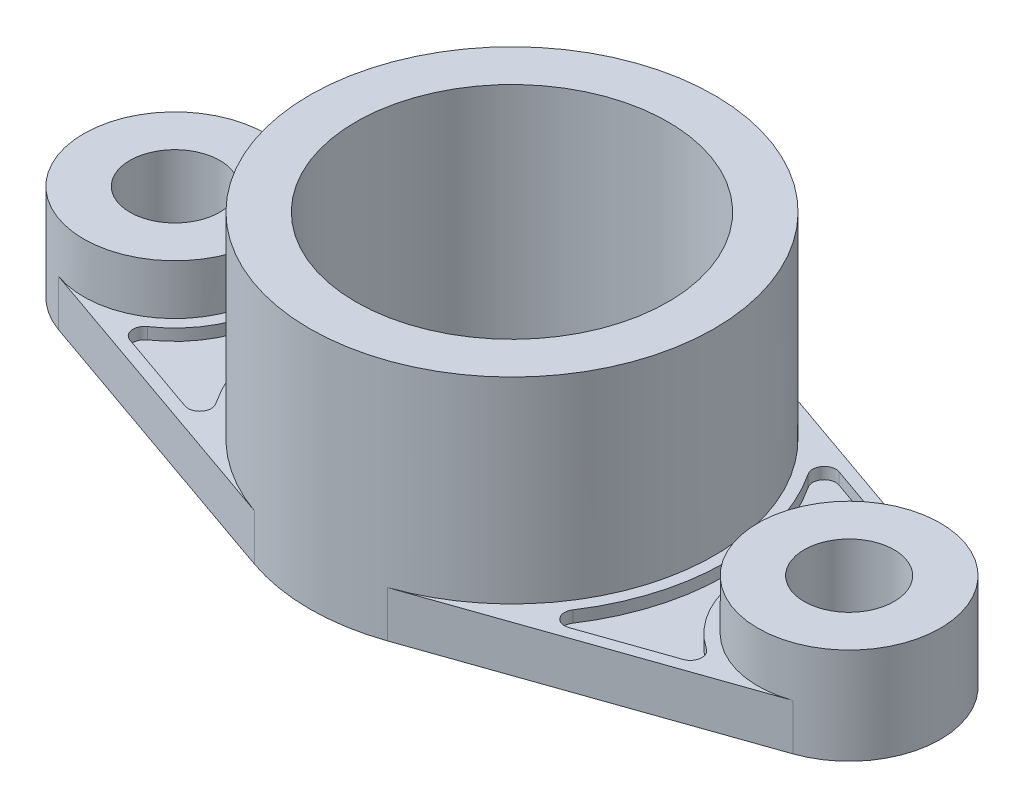
ISO-10303-21;
HEADER;
FILE_DESCRIPTION(('STEP AP214'),'2;1');
FILE_NAME('part.step','',(''),(''),'','','');
FILE_SCHEMA(('AUTOMOTIVE_DESIGN { 1 0 10303 214 1 1 1 1 }'));
ENDSEC;
DATA;
#1=APPLICATION_CONTEXT('core data for automotive mechanical design processes');
#2=APPLICATION_PROTOCOL_DEFINITION('international standard','automotive_design',2000,#1);
#3=PRODUCT_CONTEXT('',#1,'mechanical');
#4=PRODUCT('Part','Part','',(#3));
#5=PRODUCT_RELATED_PRODUCT_CATEGORY('part','',(#4));
#6=PRODUCT_DEFINITION_FORMATION('','',#4);
#7=PRODUCT_DEFINITION_CONTEXT('part definition',#1,'design');
#8=PRODUCT_DEFINITION('design','',#6,#7);
#9=PRODUCT_DEFINITION_SHAPE('','',#8);
#10=(LENGTH_UNIT() NAMED_UNIT(*) SI_UNIT(.MILLI.,.METRE.));
#11=(NAMED_UNIT(*) PLANE_ANGLE_UNIT() SI_UNIT($,.RADIAN.));
#12=(NAMED_UNIT(*) SI_UNIT($,.STERADIAN.) SOLID_ANGLE_UNIT());
#13=UNCERTAINTY_MEASURE_WITH_UNIT(LENGTH_MEASURE(1.E-05),#10,'distance_accuracy_value','');
#14=(GEOMETRIC_REPRESENTATION_CONTEXT(3) GLOBAL_UNCERTAINTY_ASSIGNED_CONTEXT((#13)) GLOBAL_UNIT_ASSIGNED_CONTEXT((#10,
#11,#12)) REPRESENTATION_CONTEXT('',''));
#15=CARTESIAN_POINT('',(0.,0.,0.));
#16=DIRECTION('',(0.,0.,1.));
#17=DIRECTION('',(1.,0.,0.));
#18=AXIS2_PLACEMENT_3D('',#15,#16,#17);
#19=CARTESIAN_POINT('',(0.,63.,0.));
#20=DIRECTION('',(0.,-1.,0.));
#21=DIRECTION('',(0.,0.,-1.));
#22=AXIS2_PLACEMENT_3D('',#19,#20,#21);
#23=CYLINDRICAL_SURFACE('',#22,52.5);
#24=CARTESIAN_POINT('',(0.,63.,0.));
#25=DIRECTION('',(0.,1.,0.));
#26=DIRECTION('',(0.,0.,1.));
#27=AXIS2_PLACEMENT_3D('',#24,#25,#26);
#28=CIRCLE('',#27,52.5);
#29=CARTESIAN_POINT('',(0.,63.,52.5));
#30=VERTEX_POINT('',#29);
#31=EDGE_CURVE('E11',#30,#30,#28,.T.);
#32=ORIENTED_EDGE('',*,*,#31,.F.);
#33=EDGE_LOOP('',(#32));
#34=FACE_BOUND('',#33,.T.);
#35=DIRECTION('',(0.,-1.,0.));
#36=VECTOR('',#35,1.);
#37=CARTESIAN_POINT('',(-17.301,12.,-49.5673824102101));
#38=LINE('',#37,#36);
#39=CARTESIAN_POINT('',(-17.301,12.,-49.5673824102101));
#40=VERTEX_POINT('',#39);
#41=CARTESIAN_POINT('',(-17.301,0.,-49.5673824102101));
#42=VERTEX_POINT('',#41);
#43=EDGE_CURVE('E366',#40,#42,#38,.T.);
#44=ORIENTED_EDGE('',*,*,#43,.F.);
#45=CARTESIAN_POINT('',(0.,12.,0.));
#46=DIRECTION('',(0.,1.,0.));
#47=DIRECTION('',(0.,0.,1.));
#48=AXIS2_PLACEMENT_3D('',#45,#46,#47);
#49=CIRCLE('',#48,52.5);
#50=CARTESIAN_POINT('',(-17.301,12.,49.56738241021));
#51=VERTEX_POINT('',#50);
#52=EDGE_CURVE('E344',#40,#51,#49,.T.);
#53=ORIENTED_EDGE('',*,*,#52,.T.);
#54=DIRECTION('',(0.,-1.,0.));
#55=VECTOR('',#54,1.);
#56=CARTESIAN_POINT('',(-17.301,12.,49.56738241021));
#57=LINE('',#56,#55);
#58=CARTESIAN_POINT('',(-17.301,0.,49.56738241021));
#59=VERTEX_POINT('',#58);
#60=EDGE_CURVE('E360',#51,#59,#57,.T.);
#61=ORIENTED_EDGE('',*,*,#60,.T.);
#62=CARTESIAN_POINT('',(0.,0.,0.));
#63=DIRECTION('',(0.,1.,0.));
#64=DIRECTION('',(0.,0.,1.));
#65=AXIS2_PLACEMENT_3D('',#62,#63,#64);
#66=CIRCLE('',#65,52.5);
#67=CARTESIAN_POINT('',(17.301,0.,49.56738241021));
#68=VERTEX_POINT('',#67);
#69=EDGE_CURVE('E413',#59,#68,#66,.T.);
#70=ORIENTED_EDGE('',*,*,#69,.T.);
#71=DIRECTION('',(0.,-1.,0.));
#72=VECTOR('',#71,1.);
#73=CARTESIAN_POINT('',(17.301,12.,49.56738241021));
#74=LINE('',#73,#72);
#75=CARTESIAN_POINT('',(17.301,12.,49.56738241021));
#76=VERTEX_POINT('',#75);
#77=EDGE_CURVE('E402',#76,#68,#74,.T.);
#78=ORIENTED_EDGE('',*,*,#77,.F.);
#79=CARTESIAN_POINT('',(0.,12.,0.));
#80=DIRECTION('',(0.,1.,0.));
#81=DIRECTION('',(0.,0.,1.));
#82=AXIS2_PLACEMENT_3D('',#79,#80,#81);
#83=CIRCLE('',#82,52.5);
#84=CARTESIAN_POINT('',(17.301,12.,-49.5673824102101));
#85=VERTEX_POINT('',#84);
#86=EDGE_CURVE('E388',#76,#85,#83,.T.);
#87=ORIENTED_EDGE('',*,*,#86,.T.);
#88=DIRECTION('',(0.,-1.,0.));
#89=VECTOR('',#88,1.);
#90=CARTESIAN_POINT('',(17.301,12.,-49.5673824102101));
#91=LINE('',#90,#89);
#92=CARTESIAN_POINT('',(17.301,0.,-49.5673824102101));
#93=VERTEX_POINT('',#92);
#94=EDGE_CURVE('E404',#85,#93,#91,.T.);
#95=ORIENTED_EDGE('',*,*,#94,.T.);
#96=EDGE_CURVE('E44',#93,#42,#66,.T.);
#97=ORIENTED_EDGE('',*,*,#96,.T.);
#98=EDGE_LOOP('',(#44,#53,#61,#70,#78,#87,#95,#97));
#99=FACE_BOUND('',#98,.T.);
#100=ADVANCED_FACE('F41',(#34,#99),#23,.T.);
#101=CARTESIAN_POINT('',(0.,63.,0.));
#102=DIRECTION('',(0.,-1.,0.));
#103=DIRECTION('',(0.,0.,-1.));
#104=AXIS2_PLACEMENT_3D('',#101,#102,#103);
#105=CYLINDRICAL_SURFACE('',#104,40.5);
#106=CARTESIAN_POINT('',(0.,63.,0.));
#107=DIRECTION('',(0.,1.,0.));
#108=DIRECTION('',(0.,0.,1.));
#109=AXIS2_PLACEMENT_3D('',#106,#107,#108);
#110=CIRCLE('',#109,40.5);
#111=CARTESIAN_POINT('',(0.,63.,40.5));
#112=VERTEX_POINT('',#111);
#113=EDGE_CURVE('E49',#112,#112,#110,.T.);
#114=ORIENTED_EDGE('',*,*,#113,.T.);
#115=EDGE_LOOP('',(#114));
#116=FACE_BOUND('',#115,.T.);
#117=CARTESIAN_POINT('',(0.,0.,0.));
#118=DIRECTION('',(0.,1.,0.));
#119=DIRECTION('',(0.,0.,1.));
#120=AXIS2_PLACEMENT_3D('',#117,#118,#119);
#121=CIRCLE('',#120,40.5);
#122=CARTESIAN_POINT('',(0.,0.,40.5));
#123=VERTEX_POINT('',#122);
#124=EDGE_CURVE('E409',#123,#123,#121,.T.);
#125=ORIENTED_EDGE('',*,*,#124,.F.);
#126=EDGE_LOOP('',(#125));
#127=FACE_BOUND('',#126,.T.);
#128=ADVANCED_FACE('F43',(#116,#127),#105,.F.);
#129=CARTESIAN_POINT('',(0.,63.,0.));
#130=DIRECTION('',(0.,1.,0.));
#131=DIRECTION('',(0.,0.,1.));
#132=AXIS2_PLACEMENT_3D('',#129,#130,#131);
#133=PLANE('',#132);
#134=ORIENTED_EDGE('',*,*,#113,.F.);
#135=EDGE_LOOP('',(#134));
#136=FACE_BOUND('',#135,.T.);
#137=ORIENTED_EDGE('',*,*,#31,.T.);
#138=EDGE_LOOP('',(#137));
#139=FACE_BOUND('',#138,.T.);
#140=ADVANCED_FACE('F471',(#136,#139),#133,.T.);
#141=CARTESIAN_POINT('',(0.,0.,0.));
#142=DIRECTION('',(0.,1.,0.));
#143=DIRECTION('',(0.,0.,1.));
#144=AXIS2_PLACEMENT_3D('',#141,#142,#143);
#145=PLANE('',#144);
#146=ORIENTED_EDGE('',*,*,#124,.T.);
#147=EDGE_LOOP('',(#146));
#148=FACE_BOUND('',#147,.T.);
#149=ORIENTED_EDGE('',*,*,#96,.F.);
#150=DIRECTION('',(-0.944140617337334,0.,-0.329542857142857));
#151=VECTOR('',#150,1.);
#152=CARTESIAN_POINT('',(17.301,0.,-49.5673824102101));
#153=LINE('',#152,#151);
#154=CARTESIAN_POINT('',(95.2986317142857,0.,-22.343087709288));
#155=VERTEX_POINT('',#154);
#156=EDGE_CURVE('E378',#155,#93,#153,.T.);
#157=ORIENTED_EDGE('',*,*,#156,.F.);
#158=CARTESIAN_POINT('',(87.5,0.,0.));
#159=DIRECTION('',(0.,1.,0.));
#160=DIRECTION('',(0.,0.,1.));
#161=AXIS2_PLACEMENT_3D('',#158,#159,#160);
#162=CIRCLE('',#161,23.665);
#163=CARTESIAN_POINT('',(95.2986317142857,0.,22.343087709288));
#164=VERTEX_POINT('',#163);
#165=EDGE_CURVE('E374',#155,#164,#162,.F.);
#166=ORIENTED_EDGE('',*,*,#165,.T.);
#167=DIRECTION('',(-0.944140617337334,0.,0.329542857142857));
#168=VECTOR('',#167,1.);
#169=CARTESIAN_POINT('',(17.301,0.,49.56738241021));
#170=LINE('',#169,#168);
#171=EDGE_CURVE('E390',#164,#68,#170,.T.);
#172=ORIENTED_EDGE('',*,*,#171,.T.);
#173=ORIENTED_EDGE('',*,*,#69,.F.);
#174=DIRECTION('',(0.944140617337334,0.,0.329542857142857));
#175=VECTOR('',#174,1.);
#176=CARTESIAN_POINT('',(-17.301,0.,49.56738241021));
#177=LINE('',#176,#175);
#178=CARTESIAN_POINT('',(-95.2986317142857,0.,22.343087709288));
#179=VERTEX_POINT('',#178);
#180=EDGE_CURVE('E346',#179,#59,#177,.T.);
#181=ORIENTED_EDGE('',*,*,#180,.F.);
#182=CARTESIAN_POINT('',(-87.5,0.,0.));
#183=DIRECTION('',(0.,1.,0.));
#184=DIRECTION('',(0.,0.,1.));
#185=AXIS2_PLACEMENT_3D('',#182,#183,#184);
#186=CIRCLE('',#185,23.665);
#187=CARTESIAN_POINT('',(-95.2986317142857,0.,-22.343087709288));
#188=VERTEX_POINT('',#187);
#189=EDGE_CURVE('E318',#188,#179,#186,.T.);
#190=ORIENTED_EDGE('',*,*,#189,.F.);
#191=DIRECTION('',(0.944140617337334,0.,-0.329542857142857));
#192=VECTOR('',#191,1.);
#193=CARTESIAN_POINT('',(-17.301,0.,-49.5673824102101));
#194=LINE('',#193,#192);
#195=EDGE_CURVE('E338',#188,#42,#194,.T.);
#196=ORIENTED_EDGE('',*,*,#195,.T.);
#197=EDGE_LOOP('',(#149,#157,#166,#172,#173,#181,#190,#196));
#198=FACE_BOUND('',#197,.T.);
#199=CARTESIAN_POINT('',(87.5,0.,0.));
#200=DIRECTION('',(0.,1.,0.));
#201=DIRECTION('',(0.,0.,1.));
#202=AXIS2_PLACEMENT_3D('',#199,#200,#201);
#203=CIRCLE('',#202,11.665);
#204=CARTESIAN_POINT('',(87.5,0.,11.665));
#205=VERTEX_POINT('',#204);
#206=EDGE_CURVE('E367',#205,#205,#203,.F.);
#207=ORIENTED_EDGE('',*,*,#206,.F.);
#208=EDGE_LOOP('',(#207));
#209=FACE_BOUND('',#208,.T.);
#210=CARTESIAN_POINT('',(-87.5,0.,0.));
#211=DIRECTION('',(0.,1.,0.));
#212=DIRECTION('',(0.,0.,1.));
#213=AXIS2_PLACEMENT_3D('',#210,#211,#212);
#214=CIRCLE('',#213,11.665);
#215=CARTESIAN_POINT('',(-87.5,0.,11.665));
#216=VERTEX_POINT('',#215);
#217=EDGE_CURVE('E336',#216,#216,#214,.T.);
#218=ORIENTED_EDGE('',*,*,#217,.T.);
#219=EDGE_LOOP('',(#218));
#220=FACE_BOUND('',#219,.T.);
#221=ADVANCED_FACE('F424',(#148,#198,#209,#220),#145,.F.);
#222=CARTESIAN_POINT('',(17.301,12.,-49.5673824102101));
#223=DIRECTION('',(-0.329542857142857,0.,0.944140617337334));
#224=DIRECTION('',(0.944140617337334,0.,0.329542857142857));
#225=AXIS2_PLACEMENT_3D('',#222,#223,#224);
#226=PLANE('',#225);
#227=ORIENTED_EDGE('',*,*,#156,.T.);
#228=ORIENTED_EDGE('',*,*,#94,.F.);
#229=DIRECTION('',(-0.944140617337334,0.,-0.329542857142857));
#230=VECTOR('',#229,1.);
#231=CARTESIAN_POINT('',(17.301,12.,-49.5673824102101));
#232=LINE('',#231,#230);
#233=CARTESIAN_POINT('',(95.2986317142857,12.,-22.343087709288));
#234=VERTEX_POINT('',#233);
#235=EDGE_CURVE('E387',#234,#85,#232,.T.);
#236=ORIENTED_EDGE('',*,*,#235,.F.);
#237=DIRECTION('',(0.,-1.,0.));
#238=VECTOR('',#237,1.);
#239=CARTESIAN_POINT('',(95.2986317142857,12.,-22.343087709288));
#240=LINE('',#239,#238);
#241=EDGE_CURVE('E410',#234,#155,#240,.T.);
#242=ORIENTED_EDGE('',*,*,#241,.T.);
#243=EDGE_LOOP('',(#227,#228,#236,#242));
#244=FACE_BOUND('',#243,.T.);
#245=ADVANCED_FACE('F447',(#244),#226,.F.);
#246=CARTESIAN_POINT('',(17.301,12.,49.56738241021));
#247=DIRECTION('',(0.329542857142857,0.,0.944140617337334));
#248=DIRECTION('',(0.944140617337334,0.,-0.329542857142857));
#249=AXIS2_PLACEMENT_3D('',#246,#247,#248);
#250=PLANE('',#249);
#251=ORIENTED_EDGE('',*,*,#171,.F.);
#252=DIRECTION('',(0.,-1.,0.));
#253=VECTOR('',#252,1.);
#254=CARTESIAN_POINT('',(95.2986317142857,12.,22.343087709288));
#255=LINE('',#254,#253);
#256=CARTESIAN_POINT('',(95.2986317142857,12.,22.343087709288));
#257=VERTEX_POINT('',#256);
#258=EDGE_CURVE('E397',#257,#164,#255,.T.);
#259=ORIENTED_EDGE('',*,*,#258,.F.);
#260=DIRECTION('',(-0.944140617337334,0.,0.329542857142857));
#261=VECTOR('',#260,1.);
#262=CARTESIAN_POINT('',(17.301,12.,49.56738241021));
#263=LINE('',#262,#261);
#264=EDGE_CURVE('E392',#257,#76,#263,.T.);
#265=ORIENTED_EDGE('',*,*,#264,.T.);
#266=ORIENTED_EDGE('',*,*,#77,.T.);
#267=EDGE_LOOP('',(#251,#259,#265,#266));
#268=FACE_BOUND('',#267,.T.);
#269=ADVANCED_FACE('F445',(#268),#250,.T.);
#270=CARTESIAN_POINT('',(0.,12.,0.));
#271=DIRECTION('',(0.,1.,0.));
#272=DIRECTION('',(0.,0.,1.));
#273=AXIS2_PLACEMENT_3D('',#270,#271,#272);
#274=PLANE('',#273);
#275=CARTESIAN_POINT('',(0.,12.,0.));
#276=DIRECTION('',(0.,-1.,0.));
#277=DIRECTION('',(0.,0.,1.));
#278=AXIS2_PLACEMENT_3D('',#275,#276,#277);
#279=CIRCLE('',#278,55.5);
#280=CARTESIAN_POINT('',(46.3329275961724,12.,-30.5533929436299));
#281=VERTEX_POINT('',#280);
#282=CARTESIAN_POINT('',(46.3329275961724,12.,30.5533929436299));
#283=VERTEX_POINT('',#282);
#284=EDGE_CURVE('E241',#281,#283,#279,.T.);
#285=ORIENTED_EDGE('',*,*,#284,.F.);
#286=CARTESIAN_POINT('',(48.8374101689385,12.,-32.2049276973396));
#287=DIRECTION('',(0.,-1.,0.));
#288=DIRECTION('',(0.,0.,1.));
#289=AXIS2_PLACEMENT_3D('',#286,#287,#288);
#290=CIRCLE('',#289,3.);
#291=CARTESIAN_POINT('',(49.826038740367,12.,-35.0373495493516));
#292=VERTEX_POINT('',#291);
#293=EDGE_CURVE('E59',#281,#292,#290,.T.);
#294=ORIENTED_EDGE('',*,*,#293,.T.);
#295=DIRECTION('',(0.944140617337334,0.,0.329542857142858));
#296=VECTOR('',#295,1.);
#297=CARTESIAN_POINT('',(49.826038740367,12.,-35.0373495493516));
#298=LINE('',#297,#296);
#299=CARTESIAN_POINT('',(71.8093276206941,12.,-27.3643020244495));
#300=VERTEX_POINT('',#299);
#301=EDGE_CURVE('E222',#292,#300,#298,.T.);
#302=ORIENTED_EDGE('',*,*,#301,.T.);
#303=CARTESIAN_POINT('',(70.8206990492656,12.,-24.5318801724375));
#304=DIRECTION('',(0.,1.,0.));
#305=DIRECTION('',(0.,0.,-1.));
#306=AXIS2_PLACEMENT_3D('',#303,#304,#305);
#307=CIRCLE('',#306,3.);
#308=CARTESIAN_POINT('',(72.507464694039,12.,-22.0509888689717));
#309=VERTEX_POINT('',#308);
#310=EDGE_CURVE('E254',#309,#300,#307,.T.);
#311=ORIENTED_EDGE('',*,*,#310,.F.);
#312=CARTESIAN_POINT('',(87.5,12.,0.));
#313=DIRECTION('',(0.,-1.,0.));
#314=DIRECTION('',(0.,0.,1.));
#315=AXIS2_PLACEMENT_3D('',#312,#313,#314);
#316=CIRCLE('',#315,26.665);
#317=CARTESIAN_POINT('',(72.507464694039,12.,22.0509888689717));
#318=VERTEX_POINT('',#317);
#319=EDGE_CURVE('E252',#318,#309,#316,.T.);
#320=ORIENTED_EDGE('',*,*,#319,.F.);
#321=CARTESIAN_POINT('',(70.8206990492656,12.,24.5318801724375));
#322=DIRECTION('',(0.,1.,0.));
#323=DIRECTION('',(0.,0.,-1.));
#324=AXIS2_PLACEMENT_3D('',#321,#322,#323);
#325=CIRCLE('',#324,3.);
#326=CARTESIAN_POINT('',(71.8093276206941,12.,27.3643020244495));
#327=VERTEX_POINT('',#326);
#328=EDGE_CURVE('E249',#327,#318,#325,.T.);
#329=ORIENTED_EDGE('',*,*,#328,.F.);
#330=DIRECTION('',(-0.944140617337334,0.,0.329542857142857));
#331=VECTOR('',#330,1.);
#332=CARTESIAN_POINT('',(71.8093276206941,12.,27.3643020244495));
#333=LINE('',#332,#331);
#334=CARTESIAN_POINT('',(49.826038740367,12.,35.0373495493516));
#335=VERTEX_POINT('',#334);
#336=EDGE_CURVE('E247',#327,#335,#333,.T.);
#337=ORIENTED_EDGE('',*,*,#336,.T.);
#338=CARTESIAN_POINT('',(48.8374101689384,12.,32.2049276973396));
#339=DIRECTION('',(0.,-1.,0.));
#340=DIRECTION('',(0.,0.,1.));
#341=AXIS2_PLACEMENT_3D('',#338,#339,#340);
#342=CIRCLE('',#341,3.);
#343=EDGE_CURVE('E242',#335,#283,#342,.T.);
#344=ORIENTED_EDGE('',*,*,#343,.T.);
#345=EDGE_LOOP('',(#285,#294,#302,#311,#320,#329,#337,#344));
#346=FACE_BOUND('',#345,.T.);
#347=CARTESIAN_POINT('',(87.5,12.,0.));
#348=DIRECTION('',(0.,1.,0.));
#349=DIRECTION('',(0.,0.,1.));
#350=AXIS2_PLACEMENT_3D('',#347,#348,#349);
#351=CIRCLE('',#350,23.665);
#352=EDGE_CURVE('E382',#257,#234,#351,.F.);
#353=ORIENTED_EDGE('',*,*,#352,.T.);
#354=ORIENTED_EDGE('',*,*,#235,.T.);
#355=ORIENTED_EDGE('',*,*,#86,.F.);
#356=ORIENTED_EDGE('',*,*,#264,.F.);
#357=EDGE_LOOP('',(#353,#354,#355,#356));
#358=FACE_BOUND('',#357,.T.);
#359=ADVANCED_FACE('F443',(#346,#358),#274,.T.);
#360=CARTESIAN_POINT('',(87.5,25.,0.));
#361=DIRECTION('',(0.,-1.,0.));
#362=DIRECTION('',(0.,0.,-1.));
#363=AXIS2_PLACEMENT_3D('',#360,#361,#362);
#364=CYLINDRICAL_SURFACE('',#363,23.665);
#365=CARTESIAN_POINT('',(87.5,25.,0.));
#366=DIRECTION('',(0.,1.,0.));
#367=DIRECTION('',(0.,0.,1.));
#368=AXIS2_PLACEMENT_3D('',#365,#366,#367);
#369=CIRCLE('',#368,23.665);
#370=CARTESIAN_POINT('',(87.5,25.,23.665));
#371=VERTEX_POINT('',#370);
#372=EDGE_CURVE('E372',#371,#371,#369,.F.);
#373=ORIENTED_EDGE('',*,*,#372,.T.);
#374=EDGE_LOOP('',(#373));
#375=FACE_BOUND('',#374,.T.);
#376=ORIENTED_EDGE('',*,*,#241,.F.);
#377=ORIENTED_EDGE('',*,*,#352,.F.);
#378=ORIENTED_EDGE('',*,*,#258,.T.);
#379=ORIENTED_EDGE('',*,*,#165,.F.);
#380=EDGE_LOOP('',(#376,#377,#378,#379));
#381=FACE_BOUND('',#380,.T.);
#382=ADVANCED_FACE('F449',(#375,#381),#364,.T.);
#383=CARTESIAN_POINT('',(87.5,25.,0.));
#384=DIRECTION('',(0.,-1.,0.));
#385=DIRECTION('',(0.,0.,-1.));
#386=AXIS2_PLACEMENT_3D('',#383,#384,#385);
#387=CYLINDRICAL_SURFACE('',#386,11.665);
#388=CARTESIAN_POINT('',(87.5,25.,0.));
#389=DIRECTION('',(0.,1.,0.));
#390=DIRECTION('',(0.,0.,1.));
#391=AXIS2_PLACEMENT_3D('',#388,#389,#390);
#392=CIRCLE('',#391,11.665);
#393=CARTESIAN_POINT('',(87.5,25.,11.665));
#394=VERTEX_POINT('',#393);
#395=EDGE_CURVE('E371',#394,#394,#392,.F.);
#396=ORIENTED_EDGE('',*,*,#395,.F.);
#397=EDGE_LOOP('',(#396));
#398=FACE_BOUND('',#397,.T.);
#399=ORIENTED_EDGE('',*,*,#206,.T.);
#400=EDGE_LOOP('',(#399));
#401=FACE_BOUND('',#400,.T.);
#402=ADVANCED_FACE('F455',(#398,#401),#387,.F.);
#403=CARTESIAN_POINT('',(0.,25.,0.));
#404=DIRECTION('',(0.,1.,0.));
#405=DIRECTION('',(0.,0.,1.));
#406=AXIS2_PLACEMENT_3D('',#403,#404,#405);
#407=PLANE('',#406);
#408=ORIENTED_EDGE('',*,*,#395,.T.);
#409=EDGE_LOOP('',(#408));
#410=FACE_BOUND('',#409,.T.);
#411=ORIENTED_EDGE('',*,*,#372,.F.);
#412=EDGE_LOOP('',(#411));
#413=FACE_BOUND('',#412,.T.);
#414=ADVANCED_FACE('F459',(#410,#413),#407,.T.);
#415=CARTESIAN_POINT('',(-17.301,12.,-49.5673824102101));
#416=DIRECTION('',(-0.329542857142857,0.,-0.944140617337334));
#417=DIRECTION('',(-0.944140617337334,0.,0.329542857142857));
#418=AXIS2_PLACEMENT_3D('',#415,#416,#417);
#419=PLANE('',#418);
#420=ORIENTED_EDGE('',*,*,#195,.F.);
#421=DIRECTION('',(0.,-1.,0.));
#422=VECTOR('',#421,1.);
#423=CARTESIAN_POINT('',(-95.2986317142857,12.,-22.343087709288));
#424=LINE('',#423,#422);
#425=CARTESIAN_POINT('',(-95.2986317142857,12.,-22.343087709288));
#426=VERTEX_POINT('',#425);
#427=EDGE_CURVE('E364',#426,#188,#424,.T.);
#428=ORIENTED_EDGE('',*,*,#427,.F.);
#429=DIRECTION('',(0.944140617337334,0.,-0.329542857142857));
#430=VECTOR('',#429,1.);
#431=CARTESIAN_POINT('',(-17.301,12.,-49.5673824102101));
#432=LINE('',#431,#430);
#433=EDGE_CURVE('E350',#426,#40,#432,.T.);
#434=ORIENTED_EDGE('',*,*,#433,.T.);
#435=ORIENTED_EDGE('',*,*,#43,.T.);
#436=EDGE_LOOP('',(#420,#428,#434,#435));
#437=FACE_BOUND('',#436,.T.);
#438=ADVANCED_FACE('F429',(#437),#419,.T.);
#439=CARTESIAN_POINT('',(-17.301,12.,49.56738241021));
#440=DIRECTION('',(0.329542857142857,0.,-0.944140617337334));
#441=DIRECTION('',(-0.944140617337334,0.,-0.329542857142857));
#442=AXIS2_PLACEMENT_3D('',#439,#440,#441);
#443=PLANE('',#442);
#444=ORIENTED_EDGE('',*,*,#180,.T.);
#445=ORIENTED_EDGE('',*,*,#60,.F.);
#446=DIRECTION('',(0.944140617337334,0.,0.329542857142857));
#447=VECTOR('',#446,1.);
#448=CARTESIAN_POINT('',(-17.301,12.,49.56738241021));
#449=LINE('',#448,#447);
#450=CARTESIAN_POINT('',(-95.2986317142857,12.,22.343087709288));
#451=VERTEX_POINT('',#450);
#452=EDGE_CURVE('E353',#451,#51,#449,.T.);
#453=ORIENTED_EDGE('',*,*,#452,.F.);
#454=DIRECTION('',(0.,-1.,0.));
#455=VECTOR('',#454,1.);
#456=CARTESIAN_POINT('',(-95.2986317142857,12.,22.343087709288));
#457=LINE('',#456,#455);
#458=EDGE_CURVE('E361',#451,#179,#457,.T.);
#459=ORIENTED_EDGE('',*,*,#458,.T.);
#460=EDGE_LOOP('',(#444,#445,#453,#459));
#461=FACE_BOUND('',#460,.T.);
#462=ADVANCED_FACE('F590',(#461),#443,.F.);
#463=CARTESIAN_POINT('',(0.,12.,0.));
#464=DIRECTION('',(0.,1.,0.));
#465=DIRECTION('',(0.,0.,1.));
#466=AXIS2_PLACEMENT_3D('',#463,#464,#465);
#467=PLANE('',#466);
#468=CARTESIAN_POINT('',(-48.8374101689385,12.,-32.2049276973396));
#469=DIRECTION('',(0.,1.,0.));
#470=DIRECTION('',(0.,0.,1.));
#471=AXIS2_PLACEMENT_3D('',#468,#469,#470);
#472=CIRCLE('',#471,3.);
#473=CARTESIAN_POINT('',(-46.3329275961724,12.,-30.5533929436299));
#474=VERTEX_POINT('',#473);
#475=CARTESIAN_POINT('',(-49.826038740367,12.,-35.0373495493516));
#476=VERTEX_POINT('',#475);
#477=EDGE_CURVE('E67',#474,#476,#472,.T.);
#478=ORIENTED_EDGE('',*,*,#477,.F.);
#479=CARTESIAN_POINT('',(0.,12.,0.));
#480=DIRECTION('',(0.,1.,0.));
#481=DIRECTION('',(0.,0.,1.));
#482=AXIS2_PLACEMENT_3D('',#479,#480,#481);
#483=CIRCLE('',#482,55.5);
#484=CARTESIAN_POINT('',(-46.3329275961724,12.,30.5533929436299));
#485=VERTEX_POINT('',#484);
#486=EDGE_CURVE('E280',#474,#485,#483,.T.);
#487=ORIENTED_EDGE('',*,*,#486,.T.);
#488=CARTESIAN_POINT('',(-48.8374101689384,12.,32.2049276973396));
#489=DIRECTION('',(0.,1.,0.));
#490=DIRECTION('',(0.,0.,1.));
#491=AXIS2_PLACEMENT_3D('',#488,#489,#490);
#492=CIRCLE('',#491,3.);
#493=CARTESIAN_POINT('',(-49.826038740367,12.,35.0373495493516));
#494=VERTEX_POINT('',#493);
#495=EDGE_CURVE('E313',#494,#485,#492,.T.);
#496=ORIENTED_EDGE('',*,*,#495,.F.);
#497=DIRECTION('',(0.944140617337334,0.,0.329542857142857));
#498=VECTOR('',#497,1.);
#499=CARTESIAN_POINT('',(-71.8093276206941,12.,27.3643020244495));
#500=LINE('',#499,#498);
#501=CARTESIAN_POINT('',(-71.8093276206941,12.,27.3643020244495));
#502=VERTEX_POINT('',#501);
#503=EDGE_CURVE('E306',#502,#494,#500,.T.);
#504=ORIENTED_EDGE('',*,*,#503,.F.);
#505=CARTESIAN_POINT('',(-70.8206990492656,12.,24.5318801724375));
#506=DIRECTION('',(0.,-1.,0.));
#507=DIRECTION('',(0.,0.,-1.));
#508=AXIS2_PLACEMENT_3D('',#505,#506,#507);
#509=CIRCLE('',#508,3.);
#510=CARTESIAN_POINT('',(-72.507464694039,12.,22.0509888689717));
#511=VERTEX_POINT('',#510);
#512=EDGE_CURVE('E301',#502,#511,#509,.T.);
#513=ORIENTED_EDGE('',*,*,#512,.T.);
#514=CARTESIAN_POINT('',(-87.5,12.,0.));
#515=DIRECTION('',(0.,1.,0.));
#516=DIRECTION('',(0.,0.,1.));
#517=AXIS2_PLACEMENT_3D('',#514,#515,#516);
#518=CIRCLE('',#517,26.665);
#519=CARTESIAN_POINT('',(-72.507464694039,12.,-22.0509888689717));
#520=VERTEX_POINT('',#519);
#521=EDGE_CURVE('E305',#511,#520,#518,.T.);
#522=ORIENTED_EDGE('',*,*,#521,.T.);
#523=CARTESIAN_POINT('',(-70.8206990492656,12.,-24.5318801724375));
#524=DIRECTION('',(0.,-1.,0.));
#525=DIRECTION('',(0.,0.,-1.));
#526=AXIS2_PLACEMENT_3D('',#523,#524,#525);
#527=CIRCLE('',#526,3.);
#528=CARTESIAN_POINT('',(-71.8093276206941,12.,-27.3643020244495));
#529=VERTEX_POINT('',#528);
#530=EDGE_CURVE('E298',#520,#529,#527,.T.);
#531=ORIENTED_EDGE('',*,*,#530,.T.);
#532=DIRECTION('',(-0.944140617337334,0.,0.329542857142858));
#533=VECTOR('',#532,1.);
#534=CARTESIAN_POINT('',(-49.826038740367,12.,-35.0373495493516));
#535=LINE('',#534,#533);
#536=EDGE_CURVE('E296',#476,#529,#535,.T.);
#537=ORIENTED_EDGE('',*,*,#536,.F.);
#538=EDGE_LOOP('',(#478,#487,#496,#504,#513,#522,#531,#537));
#539=FACE_BOUND('',#538,.T.);
#540=ORIENTED_EDGE('',*,*,#52,.F.);
#541=ORIENTED_EDGE('',*,*,#433,.F.);
#542=CARTESIAN_POINT('',(-87.5,12.,0.));
#543=DIRECTION('',(0.,1.,0.));
#544=DIRECTION('',(0.,0.,1.));
#545=AXIS2_PLACEMENT_3D('',#542,#543,#544);
#546=CIRCLE('',#545,23.665);
#547=EDGE_CURVE('E351',#451,#426,#546,.T.);
#548=ORIENTED_EDGE('',*,*,#547,.F.);
#549=ORIENTED_EDGE('',*,*,#452,.T.);
#550=EDGE_LOOP('',(#540,#541,#548,#549));
#551=FACE_BOUND('',#550,.T.);
#552=ADVANCED_FACE('F440',(#539,#551),#467,.T.);
#553=CARTESIAN_POINT('',(-87.5,25.,0.));
#554=DIRECTION('',(0.,-1.,0.));
#555=DIRECTION('',(0.,0.,-1.));
#556=AXIS2_PLACEMENT_3D('',#553,#554,#555);
#557=CYLINDRICAL_SURFACE('',#556,23.665);
#558=ORIENTED_EDGE('',*,*,#458,.F.);
#559=ORIENTED_EDGE('',*,*,#547,.T.);
#560=ORIENTED_EDGE('',*,*,#427,.T.);
#561=ORIENTED_EDGE('',*,*,#189,.T.);
#562=EDGE_LOOP('',(#558,#559,#560,#561));
#563=FACE_BOUND('',#562,.T.);
#564=CARTESIAN_POINT('',(-87.5,25.,0.));
#565=DIRECTION('',(0.,1.,0.));
#566=DIRECTION('',(0.,0.,1.));
#567=AXIS2_PLACEMENT_3D('',#564,#565,#566);
#568=CIRCLE('',#567,23.665);
#569=CARTESIAN_POINT('',(-87.5,25.,23.665));
#570=VERTEX_POINT('',#569);
#571=EDGE_CURVE('E335',#570,#570,#568,.T.);
#572=ORIENTED_EDGE('',*,*,#571,.F.);
#573=EDGE_LOOP('',(#572));
#574=FACE_BOUND('',#573,.T.);
#575=ADVANCED_FACE('F433',(#563,#574),#557,.T.);
#576=CARTESIAN_POINT('',(-87.5,25.,0.));
#577=DIRECTION('',(0.,-1.,0.));
#578=DIRECTION('',(0.,0.,-1.));
#579=AXIS2_PLACEMENT_3D('',#576,#577,#578);
#580=CYLINDRICAL_SURFACE('',#579,11.665);
#581=CARTESIAN_POINT('',(-87.5,25.,0.));
#582=DIRECTION('',(0.,1.,0.));
#583=DIRECTION('',(0.,0.,1.));
#584=AXIS2_PLACEMENT_3D('',#581,#582,#583);
#585=CIRCLE('',#584,11.665);
#586=CARTESIAN_POINT('',(-87.5,25.,11.665));
#587=VERTEX_POINT('',#586);
#588=EDGE_CURVE('E333',#587,#587,#585,.T.);
#589=ORIENTED_EDGE('',*,*,#588,.T.);
#590=EDGE_LOOP('',(#589));
#591=FACE_BOUND('',#590,.T.);
#592=ORIENTED_EDGE('',*,*,#217,.F.);
#593=EDGE_LOOP('',(#592));
#594=FACE_BOUND('',#593,.T.);
#595=ADVANCED_FACE('F525',(#591,#594),#580,.F.);
#596=CARTESIAN_POINT('',(0.,25.,0.));
#597=DIRECTION('',(0.,1.,0.));
#598=DIRECTION('',(0.,0.,1.));
#599=AXIS2_PLACEMENT_3D('',#596,#597,#598);
#600=PLANE('',#599);
#601=ORIENTED_EDGE('',*,*,#571,.T.);
#602=EDGE_LOOP('',(#601));
#603=FACE_BOUND('',#602,.T.);
#604=ORIENTED_EDGE('',*,*,#588,.F.);
#605=EDGE_LOOP('',(#604));
#606=FACE_BOUND('',#605,.T.);
#607=ADVANCED_FACE('F513',(#603,#606),#600,.T.);
#608=CARTESIAN_POINT('',(-48.8374101689385,9.,-32.2049276973396));
#609=DIRECTION('',(0.,1.,0.));
#610=DIRECTION('',(0.,0.,1.));
#611=AXIS2_PLACEMENT_3D('',#608,#609,#610);
#612=CYLINDRICAL_SURFACE('',#611,3.);
#613=ORIENTED_EDGE('',*,*,#477,.T.);
#614=DIRECTION('',(0.,1.,0.));
#615=VECTOR('',#614,1.);
#616=CARTESIAN_POINT('',(-49.826038740367,9.,-35.0373495493516));
#617=LINE('',#616,#615);
#618=CARTESIAN_POINT('',(-49.826038740367,9.,-35.0373495493516));
#619=VERTEX_POINT('',#618);
#620=EDGE_CURVE('E294',#619,#476,#617,.T.);
#621=ORIENTED_EDGE('',*,*,#620,.F.);
#622=CARTESIAN_POINT('',(-48.8374101689385,9.,-32.2049276973396));
#623=DIRECTION('',(0.,1.,0.));
#624=DIRECTION('',(0.,0.,1.));
#625=AXIS2_PLACEMENT_3D('',#622,#623,#624);
#626=CIRCLE('',#625,3.);
#627=CARTESIAN_POINT('',(-46.3329275961724,9.,-30.5533929436299));
#628=VERTEX_POINT('',#627);
#629=EDGE_CURVE('E272',#628,#619,#626,.T.);
#630=ORIENTED_EDGE('',*,*,#629,.F.);
#631=DIRECTION('',(0.,1.,0.));
#632=VECTOR('',#631,1.);
#633=CARTESIAN_POINT('',(-46.3329275961724,9.,-30.5533929436299));
#634=LINE('',#633,#632);
#635=EDGE_CURVE('E316',#628,#474,#634,.T.);
#636=ORIENTED_EDGE('',*,*,#635,.T.);
#637=EDGE_LOOP('',(#613,#621,#630,#636));
#638=FACE_BOUND('',#637,.T.);
#639=ADVANCED_FACE('F522',(#638),#612,.F.);
#640=CARTESIAN_POINT('',(0.,9.,0.));
#641=DIRECTION('',(0.,1.,0.));
#642=DIRECTION('',(0.,0.,1.));
#643=AXIS2_PLACEMENT_3D('',#640,#641,#642);
#644=CYLINDRICAL_SURFACE('',#643,55.5);
#645=ORIENTED_EDGE('',*,*,#486,.F.);
#646=ORIENTED_EDGE('',*,*,#635,.F.);
#647=CARTESIAN_POINT('',(0.,9.,0.));
#648=DIRECTION('',(0.,1.,0.));
#649=DIRECTION('',(0.,0.,1.));
#650=AXIS2_PLACEMENT_3D('',#647,#648,#649);
#651=CIRCLE('',#650,55.5);
#652=CARTESIAN_POINT('',(-46.3329275961724,9.,30.5533929436299));
#653=VERTEX_POINT('',#652);
#654=EDGE_CURVE('E295',#628,#653,#651,.T.);
#655=ORIENTED_EDGE('',*,*,#654,.T.);
#656=DIRECTION('',(0.,1.,0.));
#657=VECTOR('',#656,1.);
#658=CARTESIAN_POINT('',(-46.3329275961724,9.,30.5533929436299));
#659=LINE('',#658,#657);
#660=EDGE_CURVE('E317',#653,#485,#659,.T.);
#661=ORIENTED_EDGE('',*,*,#660,.T.);
#662=EDGE_LOOP('',(#645,#646,#655,#661));
#663=FACE_BOUND('',#662,.T.);
#664=ADVANCED_FACE('F613',(#663),#644,.T.);
#665=CARTESIAN_POINT('',(-48.8374101689384,9.,32.2049276973396));
#666=DIRECTION('',(0.,1.,0.));
#667=DIRECTION('',(0.,0.,1.));
#668=AXIS2_PLACEMENT_3D('',#665,#666,#667);
#669=CYLINDRICAL_SURFACE('',#668,3.);
#670=ORIENTED_EDGE('',*,*,#495,.T.);
#671=ORIENTED_EDGE('',*,*,#660,.F.);
#672=CARTESIAN_POINT('',(-48.8374101689384,9.,32.2049276973396));
#673=DIRECTION('',(0.,1.,0.));
#674=DIRECTION('',(0.,0.,1.));
#675=AXIS2_PLACEMENT_3D('',#672,#673,#674);
#676=CIRCLE('',#675,3.);
#677=CARTESIAN_POINT('',(-49.826038740367,9.,35.0373495493516));
#678=VERTEX_POINT('',#677);
#679=EDGE_CURVE('E289',#678,#653,#676,.T.);
#680=ORIENTED_EDGE('',*,*,#679,.F.);
#681=DIRECTION('',(0.,1.,0.));
#682=VECTOR('',#681,1.);
#683=CARTESIAN_POINT('',(-49.826038740367,9.,35.0373495493516));
#684=LINE('',#683,#682);
#685=EDGE_CURVE('E321',#678,#494,#684,.T.);
#686=ORIENTED_EDGE('',*,*,#685,.T.);
#687=EDGE_LOOP('',(#670,#671,#680,#686));
#688=FACE_BOUND('',#687,.T.);
#689=ADVANCED_FACE('F625',(#688),#669,.F.);
#690=CARTESIAN_POINT('',(-71.8093276206941,9.,27.3643020244495));
#691=DIRECTION('',(-0.329542857142857,0.,0.944140617337334));
#692=DIRECTION('',(0.944140617337334,0.,0.329542857142857));
#693=AXIS2_PLACEMENT_3D('',#690,#691,#692);
#694=PLANE('',#693);
#695=ORIENTED_EDGE('',*,*,#503,.T.);
#696=ORIENTED_EDGE('',*,*,#685,.F.);
#697=DIRECTION('',(0.944140617337334,0.,0.329542857142857));
#698=VECTOR('',#697,1.);
#699=CARTESIAN_POINT('',(-71.8093276206941,9.,27.3643020244495));
#700=LINE('',#699,#698);
#701=CARTESIAN_POINT('',(-71.8093276206941,9.,27.3643020244495));
#702=VERTEX_POINT('',#701);
#703=EDGE_CURVE('E287',#702,#678,#700,.T.);
#704=ORIENTED_EDGE('',*,*,#703,.F.);
#705=DIRECTION('',(0.,1.,0.));
#706=VECTOR('',#705,1.);
#707=CARTESIAN_POINT('',(-71.8093276206941,9.,27.3643020244495));
#708=LINE('',#707,#706);
#709=EDGE_CURVE('E323',#702,#502,#708,.T.);
#710=ORIENTED_EDGE('',*,*,#709,.T.);
#711=EDGE_LOOP('',(#695,#696,#704,#710));
#712=FACE_BOUND('',#711,.T.);
#713=ADVANCED_FACE('F632',(#712),#694,.F.);
#714=CARTESIAN_POINT('',(-70.8206990492656,9.,24.5318801724375));
#715=DIRECTION('',(0.,1.,0.));
#716=DIRECTION('',(0.,0.,1.));
#717=AXIS2_PLACEMENT_3D('',#714,#715,#716);
#718=CYLINDRICAL_SURFACE('',#717,3.);
#719=ORIENTED_EDGE('',*,*,#512,.F.);
#720=ORIENTED_EDGE('',*,*,#709,.F.);
#721=CARTESIAN_POINT('',(-70.8206990492656,9.,24.5318801724375));
#722=DIRECTION('',(0.,-1.,0.));
#723=DIRECTION('',(0.,0.,-1.));
#724=AXIS2_PLACEMENT_3D('',#721,#722,#723);
#725=CIRCLE('',#724,3.);
#726=CARTESIAN_POINT('',(-72.507464694039,9.,22.0509888689717));
#727=VERTEX_POINT('',#726);
#728=EDGE_CURVE('E283',#702,#727,#725,.T.);
#729=ORIENTED_EDGE('',*,*,#728,.T.);
#730=DIRECTION('',(0.,1.,0.));
#731=VECTOR('',#730,1.);
#732=CARTESIAN_POINT('',(-72.507464694039,9.,22.0509888689717));
#733=LINE('',#732,#731);
#734=EDGE_CURVE('E324',#727,#511,#733,.T.);
#735=ORIENTED_EDGE('',*,*,#734,.T.);
#736=EDGE_LOOP('',(#719,#720,#729,#735));
#737=FACE_BOUND('',#736,.T.);
#738=ADVANCED_FACE('F639',(#737),#718,.F.);
#739=CARTESIAN_POINT('',(-87.5,9.,0.));
#740=DIRECTION('',(0.,1.,0.));
#741=DIRECTION('',(0.,0.,1.));
#742=AXIS2_PLACEMENT_3D('',#739,#740,#741);
#743=CYLINDRICAL_SURFACE('',#742,26.665);
#744=ORIENTED_EDGE('',*,*,#521,.F.);
#745=ORIENTED_EDGE('',*,*,#734,.F.);
#746=CARTESIAN_POINT('',(-87.5,9.,0.));
#747=DIRECTION('',(0.,1.,0.));
#748=DIRECTION('',(0.,0.,1.));
#749=AXIS2_PLACEMENT_3D('',#746,#747,#748);
#750=CIRCLE('',#749,26.665);
#751=CARTESIAN_POINT('',(-72.507464694039,9.,-22.0509888689717));
#752=VERTEX_POINT('',#751);
#753=EDGE_CURVE('E285',#727,#752,#750,.T.);
#754=ORIENTED_EDGE('',*,*,#753,.T.);
#755=DIRECTION('',(0.,1.,0.));
#756=VECTOR('',#755,1.);
#757=CARTESIAN_POINT('',(-72.507464694039,9.,-22.0509888689717));
#758=LINE('',#757,#756);
#759=EDGE_CURVE('E330',#752,#520,#758,.T.);
#760=ORIENTED_EDGE('',*,*,#759,.T.);
#761=EDGE_LOOP('',(#744,#745,#754,#760));
#762=FACE_BOUND('',#761,.T.);
#763=ADVANCED_FACE('F647',(#762),#743,.T.);
#764=CARTESIAN_POINT('',(-70.8206990492656,9.,-24.5318801724375));
#765=DIRECTION('',(0.,1.,0.));
#766=DIRECTION('',(0.,0.,1.));
#767=AXIS2_PLACEMENT_3D('',#764,#765,#766);
#768=CYLINDRICAL_SURFACE('',#767,3.);
#769=ORIENTED_EDGE('',*,*,#530,.F.);
#770=ORIENTED_EDGE('',*,*,#759,.F.);
#771=CARTESIAN_POINT('',(-70.8206990492656,9.,-24.5318801724375));
#772=DIRECTION('',(0.,-1.,0.));
#773=DIRECTION('',(0.,0.,-1.));
#774=AXIS2_PLACEMENT_3D('',#771,#772,#773);
#775=CIRCLE('',#774,3.);
#776=CARTESIAN_POINT('',(-71.8093276206941,9.,-27.3643020244495));
#777=VERTEX_POINT('',#776);
#778=EDGE_CURVE('E278',#752,#777,#775,.T.);
#779=ORIENTED_EDGE('',*,*,#778,.T.);
#780=DIRECTION('',(0.,1.,0.));
#781=VECTOR('',#780,1.);
#782=CARTESIAN_POINT('',(-71.8093276206941,9.,-27.3643020244495));
#783=LINE('',#782,#781);
#784=EDGE_CURVE('E328',#777,#529,#783,.T.);
#785=ORIENTED_EDGE('',*,*,#784,.T.);
#786=EDGE_LOOP('',(#769,#770,#779,#785));
#787=FACE_BOUND('',#786,.T.);
#788=ADVANCED_FACE('F657',(#787),#768,.F.);
#789=CARTESIAN_POINT('',(-49.826038740367,9.,-35.0373495493516));
#790=DIRECTION('',(-0.329542857142858,0.,-0.944140617337334));
#791=DIRECTION('',(-0.944140617337334,0.,0.329542857142858));
#792=AXIS2_PLACEMENT_3D('',#789,#790,#791);
#793=PLANE('',#792);
#794=ORIENTED_EDGE('',*,*,#536,.T.);
#795=ORIENTED_EDGE('',*,*,#784,.F.);
#796=DIRECTION('',(-0.944140617337334,0.,0.329542857142858));
#797=VECTOR('',#796,1.);
#798=CARTESIAN_POINT('',(-49.826038740367,9.,-35.0373495493516));
#799=LINE('',#798,#797);
#800=EDGE_CURVE('E277',#619,#777,#799,.T.);
#801=ORIENTED_EDGE('',*,*,#800,.F.);
#802=ORIENTED_EDGE('',*,*,#620,.T.);
#803=EDGE_LOOP('',(#794,#795,#801,#802));
#804=FACE_BOUND('',#803,.T.);
#805=ADVANCED_FACE('F670',(#804),#793,.F.);
#806=CARTESIAN_POINT('',(-48.8374101689385,9.,-32.2049276973396));
#807=DIRECTION('',(0.,1.,0.));
#808=DIRECTION('',(0.,0.,1.));
#809=AXIS2_PLACEMENT_3D('',#806,#807,#808);
#810=PLANE('',#809);
#811=ORIENTED_EDGE('',*,*,#629,.T.);
#812=ORIENTED_EDGE('',*,*,#800,.T.);
#813=ORIENTED_EDGE('',*,*,#778,.F.);
#814=ORIENTED_EDGE('',*,*,#753,.F.);
#815=ORIENTED_EDGE('',*,*,#728,.F.);
#816=ORIENTED_EDGE('',*,*,#703,.T.);
#817=ORIENTED_EDGE('',*,*,#679,.T.);
#818=ORIENTED_EDGE('',*,*,#654,.F.);
#819=EDGE_LOOP('',(#811,#812,#813,#814,#815,#816,#817,#818));
#820=FACE_BOUND('',#819,.T.);
#821=ADVANCED_FACE('F677',(#820),#810,.T.);
#822=CARTESIAN_POINT('',(48.8374101689385,9.,-32.2049276973396));
#823=DIRECTION('',(0.,1.,0.));
#824=DIRECTION('',(0.,0.,1.));
#825=AXIS2_PLACEMENT_3D('',#822,#823,#824);
#826=CYLINDRICAL_SURFACE('',#825,3.);
#827=ORIENTED_EDGE('',*,*,#293,.F.);
#828=DIRECTION('',(0.,1.,0.));
#829=VECTOR('',#828,1.);
#830=CARTESIAN_POINT('',(46.3329275961724,9.,-30.5533929436299));
#831=LINE('',#830,#829);
#832=CARTESIAN_POINT('',(46.3329275961724,9.,-30.5533929436299));
#833=VERTEX_POINT('',#832);
#834=EDGE_CURVE('E201',#833,#281,#831,.T.);
#835=ORIENTED_EDGE('',*,*,#834,.F.);
#836=CARTESIAN_POINT('',(48.8374101689385,9.,-32.2049276973396));
#837=DIRECTION('',(0.,-1.,0.));
#838=DIRECTION('',(0.,0.,1.));
#839=AXIS2_PLACEMENT_3D('',#836,#837,#838);
#840=CIRCLE('',#839,3.);
#841=CARTESIAN_POINT('',(49.826038740367,9.,-35.0373495493516));
#842=VERTEX_POINT('',#841);
#843=EDGE_CURVE('E206',#833,#842,#840,.T.);
#844=ORIENTED_EDGE('',*,*,#843,.T.);
#845=DIRECTION('',(0.,1.,0.));
#846=VECTOR('',#845,1.);
#847=CARTESIAN_POINT('',(49.826038740367,9.,-35.0373495493516));
#848=LINE('',#847,#846);
#849=EDGE_CURVE('E257',#842,#292,#848,.T.);
#850=ORIENTED_EDGE('',*,*,#849,.T.);
#851=EDGE_LOOP('',(#827,#835,#844,#850));
#852=FACE_BOUND('',#851,.T.);
#853=ADVANCED_FACE('F202',(#852),#826,.F.);
#854=CARTESIAN_POINT('',(49.826038740367,9.,-35.0373495493516));
#855=DIRECTION('',(-0.329542857142858,0.,0.944140617337334));
#856=DIRECTION('',(0.944140617337334,0.,0.329542857142858));
#857=AXIS2_PLACEMENT_3D('',#854,#855,#856);
#858=PLANE('',#857);
#859=ORIENTED_EDGE('',*,*,#301,.F.);
#860=ORIENTED_EDGE('',*,*,#849,.F.);
#861=DIRECTION('',(0.944140617337334,0.,0.329542857142858));
#862=VECTOR('',#861,1.);
#863=CARTESIAN_POINT('',(49.826038740367,9.,-35.0373495493516));
#864=LINE('',#863,#862);
#865=CARTESIAN_POINT('',(71.8093276206941,9.,-27.3643020244495));
#866=VERTEX_POINT('',#865);
#867=EDGE_CURVE('E213',#842,#866,#864,.T.);
#868=ORIENTED_EDGE('',*,*,#867,.T.);
#869=DIRECTION('',(0.,1.,0.));
#870=VECTOR('',#869,1.);
#871=CARTESIAN_POINT('',(71.8093276206941,9.,-27.3643020244495));
#872=LINE('',#871,#870);
#873=EDGE_CURVE('E265',#866,#300,#872,.T.);
#874=ORIENTED_EDGE('',*,*,#873,.T.);
#875=EDGE_LOOP('',(#859,#860,#868,#874));
#876=FACE_BOUND('',#875,.T.);
#877=ADVANCED_FACE('F698',(#876),#858,.T.);
#878=CARTESIAN_POINT('',(70.8206990492656,9.,-24.5318801724375));
#879=DIRECTION('',(0.,1.,0.));
#880=DIRECTION('',(0.,0.,1.));
#881=AXIS2_PLACEMENT_3D('',#878,#879,#880);
#882=CYLINDRICAL_SURFACE('',#881,3.);
#883=ORIENTED_EDGE('',*,*,#310,.T.);
#884=ORIENTED_EDGE('',*,*,#873,.F.);
#885=CARTESIAN_POINT('',(70.8206990492656,9.,-24.5318801724375));
#886=DIRECTION('',(0.,1.,0.));
#887=DIRECTION('',(0.,0.,-1.));
#888=AXIS2_PLACEMENT_3D('',#885,#886,#887);
#889=CIRCLE('',#888,3.);
#890=CARTESIAN_POINT('',(72.507464694039,9.,-22.0509888689717));
#891=VERTEX_POINT('',#890);
#892=EDGE_CURVE('E240',#891,#866,#889,.T.);
#893=ORIENTED_EDGE('',*,*,#892,.F.);
#894=DIRECTION('',(0.,1.,0.));
#895=VECTOR('',#894,1.);
#896=CARTESIAN_POINT('',(72.507464694039,9.,-22.0509888689717));
#897=LINE('',#896,#895);
#898=EDGE_CURVE('E262',#891,#309,#897,.T.);
#899=ORIENTED_EDGE('',*,*,#898,.T.);
#900=EDGE_LOOP('',(#883,#884,#893,#899));
#901=FACE_BOUND('',#900,.T.);
#902=ADVANCED_FACE('F702',(#901),#882,.F.);
#903=CARTESIAN_POINT('',(87.5,9.,0.));
#904=DIRECTION('',(0.,1.,0.));
#905=DIRECTION('',(0.,0.,1.));
#906=AXIS2_PLACEMENT_3D('',#903,#904,#905);
#907=CYLINDRICAL_SURFACE('',#906,26.665);
#908=ORIENTED_EDGE('',*,*,#319,.T.);
#909=ORIENTED_EDGE('',*,*,#898,.F.);
#910=CARTESIAN_POINT('',(87.5,9.,0.));
#911=DIRECTION('',(0.,-1.,0.));
#912=DIRECTION('',(0.,0.,1.));
#913=AXIS2_PLACEMENT_3D('',#910,#911,#912);
#914=CIRCLE('',#913,26.665);
#915=CARTESIAN_POINT('',(72.507464694039,9.,22.0509888689717));
#916=VERTEX_POINT('',#915);
#917=EDGE_CURVE('E234',#916,#891,#914,.T.);
#918=ORIENTED_EDGE('',*,*,#917,.F.);
#919=DIRECTION('',(0.,1.,0.));
#920=VECTOR('',#919,1.);
#921=CARTESIAN_POINT('',(72.507464694039,9.,22.0509888689717));
#922=LINE('',#921,#920);
#923=EDGE_CURVE('E266',#916,#318,#922,.T.);
#924=ORIENTED_EDGE('',*,*,#923,.T.);
#925=EDGE_LOOP('',(#908,#909,#918,#924));
#926=FACE_BOUND('',#925,.T.);
#927=ADVANCED_FACE('F712',(#926),#907,.T.);
#928=CARTESIAN_POINT('',(70.8206990492656,9.,24.5318801724375));
#929=DIRECTION('',(0.,1.,0.));
#930=DIRECTION('',(0.,0.,1.));
#931=AXIS2_PLACEMENT_3D('',#928,#929,#930);
#932=CYLINDRICAL_SURFACE('',#931,3.);
#933=ORIENTED_EDGE('',*,*,#328,.T.);
#934=ORIENTED_EDGE('',*,*,#923,.F.);
#935=CARTESIAN_POINT('',(70.8206990492656,9.,24.5318801724375));
#936=DIRECTION('',(0.,1.,0.));
#937=DIRECTION('',(0.,0.,-1.));
#938=AXIS2_PLACEMENT_3D('',#935,#936,#937);
#939=CIRCLE('',#938,3.);
#940=CARTESIAN_POINT('',(71.8093276206941,9.,27.3643020244495));
#941=VERTEX_POINT('',#940);
#942=EDGE_CURVE('E232',#941,#916,#939,.T.);
#943=ORIENTED_EDGE('',*,*,#942,.F.);
#944=DIRECTION('',(0.,1.,0.));
#945=VECTOR('',#944,1.);
#946=CARTESIAN_POINT('',(71.8093276206941,9.,27.3643020244495));
#947=LINE('',#946,#945);
#948=EDGE_CURVE('E268',#941,#327,#947,.T.);
#949=ORIENTED_EDGE('',*,*,#948,.T.);
#950=EDGE_LOOP('',(#933,#934,#943,#949));
#951=FACE_BOUND('',#950,.T.);
#952=ADVANCED_FACE('F725',(#951),#932,.F.);
#953=CARTESIAN_POINT('',(71.8093276206941,9.,27.3643020244495));
#954=DIRECTION('',(-0.329542857142857,0.,-0.944140617337334));
#955=DIRECTION('',(-0.944140617337334,0.,0.329542857142857));
#956=AXIS2_PLACEMENT_3D('',#953,#954,#955);
#957=PLANE('',#956);
#958=ORIENTED_EDGE('',*,*,#336,.F.);
#959=ORIENTED_EDGE('',*,*,#948,.F.);
#960=DIRECTION('',(-0.944140617337334,0.,0.329542857142857));
#961=VECTOR('',#960,1.);
#962=CARTESIAN_POINT('',(71.8093276206941,9.,27.3643020244495));
#963=LINE('',#962,#961);
#964=CARTESIAN_POINT('',(49.826038740367,9.,35.0373495493516));
#965=VERTEX_POINT('',#964);
#966=EDGE_CURVE('E230',#941,#965,#963,.T.);
#967=ORIENTED_EDGE('',*,*,#966,.T.);
#968=DIRECTION('',(0.,1.,0.));
#969=VECTOR('',#968,1.);
#970=CARTESIAN_POINT('',(49.826038740367,9.,35.0373495493516));
#971=LINE('',#970,#969);
#972=EDGE_CURVE('E269',#965,#335,#971,.T.);
#973=ORIENTED_EDGE('',*,*,#972,.T.);
#974=EDGE_LOOP('',(#958,#959,#967,#973));
#975=FACE_BOUND('',#974,.T.);
#976=ADVANCED_FACE('F732',(#975),#957,.T.);
#977=CARTESIAN_POINT('',(48.8374101689384,9.,32.2049276973396));
#978=DIRECTION('',(0.,1.,0.));
#979=DIRECTION('',(0.,0.,1.));
#980=AXIS2_PLACEMENT_3D('',#977,#978,#979);
#981=CYLINDRICAL_SURFACE('',#980,3.);
#982=ORIENTED_EDGE('',*,*,#343,.F.);
#983=ORIENTED_EDGE('',*,*,#972,.F.);
#984=CARTESIAN_POINT('',(48.8374101689384,9.,32.2049276973396));
#985=DIRECTION('',(0.,-1.,0.));
#986=DIRECTION('',(0.,0.,1.));
#987=AXIS2_PLACEMENT_3D('',#984,#985,#986);
#988=CIRCLE('',#987,3.);
#989=CARTESIAN_POINT('',(46.3329275961724,9.,30.5533929436299));
#990=VERTEX_POINT('',#989);
#991=EDGE_CURVE('E223',#965,#990,#988,.T.);
#992=ORIENTED_EDGE('',*,*,#991,.T.);
#993=DIRECTION('',(0.,1.,0.));
#994=VECTOR('',#993,1.);
#995=CARTESIAN_POINT('',(46.3329275961724,9.,30.5533929436299));
#996=LINE('',#995,#994);
#997=EDGE_CURVE('E215',#990,#283,#996,.T.);
#998=ORIENTED_EDGE('',*,*,#997,.T.);
#999=EDGE_LOOP('',(#982,#983,#992,#998));
#1000=FACE_BOUND('',#999,.T.);
#1001=ADVANCED_FACE('F739',(#1000),#981,.F.);
#1002=CARTESIAN_POINT('',(0.,9.,0.));
#1003=DIRECTION('',(0.,1.,0.));
#1004=DIRECTION('',(0.,0.,1.));
#1005=AXIS2_PLACEMENT_3D('',#1002,#1003,#1004);
#1006=CYLINDRICAL_SURFACE('',#1005,55.5);
#1007=ORIENTED_EDGE('',*,*,#284,.T.);
#1008=ORIENTED_EDGE('',*,*,#997,.F.);
#1009=CARTESIAN_POINT('',(0.,9.,0.));
#1010=DIRECTION('',(0.,-1.,0.));
#1011=DIRECTION('',(0.,0.,1.));
#1012=AXIS2_PLACEMENT_3D('',#1009,#1010,#1011);
#1013=CIRCLE('',#1012,55.5);
#1014=EDGE_CURVE('E218',#833,#990,#1013,.T.);
#1015=ORIENTED_EDGE('',*,*,#1014,.F.);
#1016=ORIENTED_EDGE('',*,*,#834,.T.);
#1017=EDGE_LOOP('',(#1007,#1008,#1015,#1016));
#1018=FACE_BOUND('',#1017,.T.);
#1019=ADVANCED_FACE('F221',(#1018),#1006,.T.);
#1020=CARTESIAN_POINT('',(48.8374101689385,9.,-32.2049276973396));
#1021=DIRECTION('',(0.,1.,0.));
#1022=DIRECTION('',(0.,0.,1.));
#1023=AXIS2_PLACEMENT_3D('',#1020,#1021,#1022);
#1024=PLANE('',#1023);
#1025=ORIENTED_EDGE('',*,*,#843,.F.);
#1026=ORIENTED_EDGE('',*,*,#1014,.T.);
#1027=ORIENTED_EDGE('',*,*,#991,.F.);
#1028=ORIENTED_EDGE('',*,*,#966,.F.);
#1029=ORIENTED_EDGE('',*,*,#942,.T.);
#1030=ORIENTED_EDGE('',*,*,#917,.T.);
#1031=ORIENTED_EDGE('',*,*,#892,.T.);
#1032=ORIENTED_EDGE('',*,*,#867,.F.);
#1033=EDGE_LOOP('',(#1025,#1026,#1027,#1028,#1029,#1030,#1031,#1032));
#1034=FACE_BOUND('',#1033,.T.);
#1035=ADVANCED_FACE('F220',(#1034),#1024,.T.);
#1036=CLOSED_SHELL('',(#100,#128,#140,#221,#245,#269,#359,#382,#402,#414,#438,#462,#552,#575,
#595,#607,#639,#664,#689,#713,#738,#763,#788,#805,#821,#853,#877,#902,#927,#952,#976,#1001,
#1019,#1035));
#1037=MANIFOLD_SOLID_BREP('B2',#1036);
#1038=ADVANCED_BREP_SHAPE_REPRESENTATION('',(#18,#1037),#14);
#1039=SHAPE_DEFINITION_REPRESENTATION(#9,#1038);
ENDSEC;
END-ISO-10303-21;
